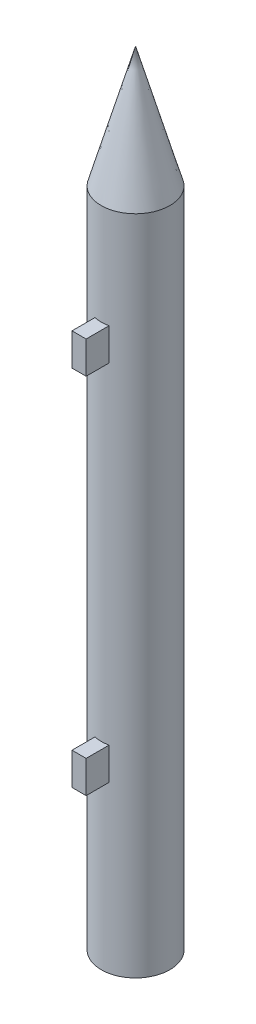
ISO-10303-21;
HEADER;
FILE_DESCRIPTION(('STEP AP214'),'2;1');
FILE_NAME('part.step','',(''),(''),'','','');
FILE_SCHEMA(('AUTOMOTIVE_DESIGN { 1 0 10303 214 1 1 1 1 }'));
ENDSEC;
DATA;
#1=APPLICATION_CONTEXT('core data for automotive mechanical design processes');
#2=APPLICATION_PROTOCOL_DEFINITION('international standard','automotive_design',2000,#1);
#3=PRODUCT_CONTEXT('',#1,'mechanical');
#4=PRODUCT('Part','Part','',(#3));
#5=PRODUCT_RELATED_PRODUCT_CATEGORY('part','',(#4));
#6=PRODUCT_DEFINITION_FORMATION('','',#4);
#7=PRODUCT_DEFINITION_CONTEXT('part definition',#1,'design');
#8=PRODUCT_DEFINITION('design','',#6,#7);
#9=PRODUCT_DEFINITION_SHAPE('','',#8);
#10=(LENGTH_UNIT() NAMED_UNIT(*) SI_UNIT(.MILLI.,.METRE.));
#11=(NAMED_UNIT(*) PLANE_ANGLE_UNIT() SI_UNIT($,.RADIAN.));
#12=(NAMED_UNIT(*) SI_UNIT($,.STERADIAN.) SOLID_ANGLE_UNIT());
#13=UNCERTAINTY_MEASURE_WITH_UNIT(LENGTH_MEASURE(1.E-05),#10,'distance_accuracy_value','');
#14=(GEOMETRIC_REPRESENTATION_CONTEXT(3) GLOBAL_UNCERTAINTY_ASSIGNED_CONTEXT((#13)) GLOBAL_UNIT_ASSIGNED_CONTEXT((#10,
#11,#12)) REPRESENTATION_CONTEXT('',''));
#15=CARTESIAN_POINT('',(0.,0.,0.));
#16=DIRECTION('',(0.,0.,1.));
#17=DIRECTION('',(1.,0.,0.));
#18=AXIS2_PLACEMENT_3D('',#15,#16,#17);
#19=CARTESIAN_POINT('',(0.,6.,-34.));
#20=DIRECTION('',(0.,-1.,0.));
#21=DIRECTION('',(0.,0.,-1.));
#22=AXIS2_PLACEMENT_3D('',#19,#20,#21);
#23=CYLINDRICAL_SURFACE('',#22,8.5);
#24=CARTESIAN_POINT('',(0.,170.,-34.));
#25=DIRECTION('',(0.,-1.,0.));
#26=DIRECTION('',(0.,0.,-1.));
#27=AXIS2_PLACEMENT_3D('',#24,#25,#26);
#28=CIRCLE('',#27,8.5);
#29=CARTESIAN_POINT('',(0.,170.,-42.5));
#30=VERTEX_POINT('',#29);
#31=EDGE_CURVE('E124',#30,#30,#28,.T.);
#32=ORIENTED_EDGE('',*,*,#31,.T.);
#33=EDGE_LOOP('',(#32));
#34=FACE_BOUND('',#33,.T.);
#35=CARTESIAN_POINT('',(0.,6.,-34.));
#36=DIRECTION('',(0.,-1.,0.));
#37=DIRECTION('',(0.,0.,-1.));
#38=AXIS2_PLACEMENT_3D('',#35,#36,#37);
#39=CIRCLE('',#38,8.5);
#40=CARTESIAN_POINT('',(0.,6.,-42.5));
#41=VERTEX_POINT('',#40);
#42=EDGE_CURVE('E129',#41,#41,#39,.T.);
#43=ORIENTED_EDGE('',*,*,#42,.F.);
#44=EDGE_LOOP('',(#43));
#45=FACE_BOUND('',#44,.T.);
#46=CARTESIAN_POINT('',(0.,55.,-34.));
#47=DIRECTION('',(0.,-1.,0.));
#48=DIRECTION('',(0.,0.,-1.));
#49=AXIS2_PLACEMENT_3D('',#46,#47,#48);
#50=CIRCLE('',#49,8.5);
#51=CARTESIAN_POINT('',(-1.75,55.,-25.6820976201929));
#52=VERTEX_POINT('',#51);
#53=CARTESIAN_POINT('',(1.75,55.,-25.6820976201929));
#54=VERTEX_POINT('',#53);
#55=EDGE_CURVE('E161',#52,#54,#50,.F.);
#56=ORIENTED_EDGE('',*,*,#55,.T.);
#57=DIRECTION('',(0.,-1.,0.));
#58=VECTOR('',#57,1.);
#59=CARTESIAN_POINT('',(1.75,6.,-25.6820976201929));
#60=LINE('',#59,#58);
#61=CARTESIAN_POINT('',(1.75,47.,-25.6820976201929));
#62=VERTEX_POINT('',#61);
#63=EDGE_CURVE('E164',#54,#62,#60,.T.);
#64=ORIENTED_EDGE('',*,*,#63,.T.);
#65=CARTESIAN_POINT('',(0.,47.,-34.));
#66=DIRECTION('',(0.,1.,0.));
#67=DIRECTION('',(0.,0.,1.));
#68=AXIS2_PLACEMENT_3D('',#65,#66,#67);
#69=CIRCLE('',#68,8.5);
#70=CARTESIAN_POINT('',(-1.75,47.,-25.6820976201929));
#71=VERTEX_POINT('',#70);
#72=EDGE_CURVE('E162',#62,#71,#69,.F.);
#73=ORIENTED_EDGE('',*,*,#72,.T.);
#74=DIRECTION('',(0.,-1.,0.));
#75=VECTOR('',#74,1.);
#76=CARTESIAN_POINT('',(-1.75,6.,-25.6820976201929));
#77=LINE('',#76,#75);
#78=EDGE_CURVE('E158',#52,#71,#77,.T.);
#79=ORIENTED_EDGE('',*,*,#78,.F.);
#80=EDGE_LOOP('',(#56,#64,#73,#79));
#81=FACE_BOUND('',#80,.T.);
#82=CARTESIAN_POINT('',(0.,145.,-34.));
#83=DIRECTION('',(0.,-1.,0.));
#84=DIRECTION('',(0.,0.,-1.));
#85=AXIS2_PLACEMENT_3D('',#82,#83,#84);
#86=CIRCLE('',#85,8.5);
#87=CARTESIAN_POINT('',(-1.75,145.,-25.6820976201929));
#88=VERTEX_POINT('',#87);
#89=CARTESIAN_POINT('',(1.75,145.,-25.6820976201929));
#90=VERTEX_POINT('',#89);
#91=EDGE_CURVE('E60',#88,#90,#86,.F.);
#92=ORIENTED_EDGE('',*,*,#91,.T.);
#93=DIRECTION('',(0.,-1.,0.));
#94=VECTOR('',#93,1.);
#95=CARTESIAN_POINT('',(1.75,6.,-25.6820976201929));
#96=LINE('',#95,#94);
#97=CARTESIAN_POINT('',(1.75,137.,-25.6820976201929));
#98=VERTEX_POINT('',#97);
#99=EDGE_CURVE('E11',#90,#98,#96,.T.);
#100=ORIENTED_EDGE('',*,*,#99,.T.);
#101=CARTESIAN_POINT('',(0.,137.,-34.));
#102=DIRECTION('',(0.,1.,0.));
#103=DIRECTION('',(0.,0.,1.));
#104=AXIS2_PLACEMENT_3D('',#101,#102,#103);
#105=CIRCLE('',#104,8.5);
#106=CARTESIAN_POINT('',(-1.75,137.,-25.6820976201929));
#107=VERTEX_POINT('',#106);
#108=EDGE_CURVE('E50',#98,#107,#105,.F.);
#109=ORIENTED_EDGE('',*,*,#108,.T.);
#110=DIRECTION('',(0.,-1.,0.));
#111=VECTOR('',#110,1.);
#112=CARTESIAN_POINT('',(-1.75,6.,-25.6820976201929));
#113=LINE('',#112,#111);
#114=EDGE_CURVE('E170',#88,#107,#113,.T.);
#115=ORIENTED_EDGE('',*,*,#114,.F.);
#116=EDGE_LOOP('',(#92,#100,#109,#115));
#117=FACE_BOUND('',#116,.T.);
#118=ADVANCED_FACE('F39',(#34,#45,#81,#117),#23,.T.);
#119=CARTESIAN_POINT('',(0.,6.,-42.5));
#120=DIRECTION('',(0.,-1.,0.));
#121=DIRECTION('',(0.,0.,-1.));
#122=AXIS2_PLACEMENT_3D('',#119,#120,#121);
#123=PLANE('',#122);
#124=ORIENTED_EDGE('',*,*,#42,.T.);
#125=EDGE_LOOP('',(#124));
#126=FACE_BOUND('',#125,.T.);
#127=ADVANCED_FACE('F41',(#126),#123,.T.);
#128=CARTESIAN_POINT('',(0.,170.,-34.));
#129=DIRECTION('',(0.,-1.,0.));
#130=DIRECTION('',(0.,0.,-1.));
#131=AXIS2_PLACEMENT_3D('',#128,#129,#130);
#132=CONICAL_SURFACE('',#131,8.5,0.276097019395437);
#133=CARTESIAN_POINT('',(0.,200.,-34.));
#134=VERTEX_POINT('',#133);
#135=VERTEX_LOOP('',#134);
#136=FACE_BOUND('',#135,.T.);
#137=ORIENTED_EDGE('',*,*,#31,.F.);
#138=EDGE_LOOP('',(#137));
#139=FACE_BOUND('',#138,.T.);
#140=ADVANCED_FACE('F194',(#136,#139),#132,.T.);
#141=CARTESIAN_POINT('',(1.75,47.,-20.));
#142=DIRECTION('',(0.,0.,-1.));
#143=DIRECTION('',(-1.,0.,0.));
#144=AXIS2_PLACEMENT_3D('',#141,#142,#143);
#145=PLANE('',#144);
#146=DIRECTION('',(0.,-1.,0.));
#147=VECTOR('',#146,1.);
#148=CARTESIAN_POINT('',(-1.75,47.,-20.));
#149=LINE('',#148,#147);
#150=CARTESIAN_POINT('',(-1.75,55.,-20.));
#151=VERTEX_POINT('',#150);
#152=CARTESIAN_POINT('',(-1.75,47.,-20.));
#153=VERTEX_POINT('',#152);
#154=EDGE_CURVE('E150',#151,#153,#149,.T.);
#155=ORIENTED_EDGE('',*,*,#154,.T.);
#156=DIRECTION('',(-1.,0.,0.));
#157=VECTOR('',#156,1.);
#158=CARTESIAN_POINT('',(1.75,47.,-20.));
#159=LINE('',#158,#157);
#160=CARTESIAN_POINT('',(1.75,47.,-20.));
#161=VERTEX_POINT('',#160);
#162=EDGE_CURVE('E133',#161,#153,#159,.T.);
#163=ORIENTED_EDGE('',*,*,#162,.F.);
#164=DIRECTION('',(0.,-1.,0.));
#165=VECTOR('',#164,1.);
#166=CARTESIAN_POINT('',(1.75,47.,-20.));
#167=LINE('',#166,#165);
#168=CARTESIAN_POINT('',(1.75,55.,-20.));
#169=VERTEX_POINT('',#168);
#170=EDGE_CURVE('E145',#169,#161,#167,.T.);
#171=ORIENTED_EDGE('',*,*,#170,.F.);
#172=DIRECTION('',(-1.,0.,0.));
#173=VECTOR('',#172,1.);
#174=CARTESIAN_POINT('',(1.75,55.,-20.));
#175=LINE('',#174,#173);
#176=EDGE_CURVE('E140',#169,#151,#175,.T.);
#177=ORIENTED_EDGE('',*,*,#176,.T.);
#178=EDGE_LOOP('',(#155,#163,#171,#177));
#179=FACE_BOUND('',#178,.T.);
#180=ADVANCED_FACE('F199',(#179),#145,.F.);
#181=CARTESIAN_POINT('',(1.75,47.,-34.));
#182=DIRECTION('',(0.,1.,0.));
#183=DIRECTION('',(0.,0.,1.));
#184=AXIS2_PLACEMENT_3D('',#181,#182,#183);
#185=PLANE('',#184);
#186=ORIENTED_EDGE('',*,*,#72,.F.);
#187=DIRECTION('',(0.,0.,-1.));
#188=VECTOR('',#187,1.);
#189=CARTESIAN_POINT('',(1.75,47.,-34.));
#190=LINE('',#189,#188);
#191=EDGE_CURVE('E151',#161,#62,#190,.T.);
#192=ORIENTED_EDGE('',*,*,#191,.F.);
#193=ORIENTED_EDGE('',*,*,#162,.T.);
#194=DIRECTION('',(0.,0.,-1.));
#195=VECTOR('',#194,1.);
#196=CARTESIAN_POINT('',(-1.75,47.,-34.));
#197=LINE('',#196,#195);
#198=EDGE_CURVE('E141',#153,#71,#197,.T.);
#199=ORIENTED_EDGE('',*,*,#198,.T.);
#200=EDGE_LOOP('',(#186,#192,#193,#199));
#201=FACE_BOUND('',#200,.T.);
#202=ADVANCED_FACE('F213',(#201),#185,.F.);
#203=CARTESIAN_POINT('',(1.75,55.,-20.));
#204=DIRECTION('',(0.,-1.,0.));
#205=DIRECTION('',(0.,0.,-1.));
#206=AXIS2_PLACEMENT_3D('',#203,#204,#205);
#207=PLANE('',#206);
#208=ORIENTED_EDGE('',*,*,#55,.F.);
#209=DIRECTION('',(0.,0.,1.));
#210=VECTOR('',#209,1.);
#211=CARTESIAN_POINT('',(-1.75,55.,-20.));
#212=LINE('',#211,#210);
#213=EDGE_CURVE('E143',#52,#151,#212,.T.);
#214=ORIENTED_EDGE('',*,*,#213,.T.);
#215=ORIENTED_EDGE('',*,*,#176,.F.);
#216=DIRECTION('',(0.,0.,1.));
#217=VECTOR('',#216,1.);
#218=CARTESIAN_POINT('',(1.75,55.,-20.));
#219=LINE('',#218,#217);
#220=EDGE_CURVE('E139',#54,#169,#219,.T.);
#221=ORIENTED_EDGE('',*,*,#220,.F.);
#222=EDGE_LOOP('',(#208,#214,#215,#221));
#223=FACE_BOUND('',#222,.T.);
#224=ADVANCED_FACE('F206',(#223),#207,.F.);
#225=CARTESIAN_POINT('',(1.75,0.,0.));
#226=DIRECTION('',(-1.,0.,0.));
#227=DIRECTION('',(0.,0.,1.));
#228=AXIS2_PLACEMENT_3D('',#225,#226,#227);
#229=PLANE('',#228);
#230=ORIENTED_EDGE('',*,*,#63,.F.);
#231=ORIENTED_EDGE('',*,*,#220,.T.);
#232=ORIENTED_EDGE('',*,*,#170,.T.);
#233=ORIENTED_EDGE('',*,*,#191,.T.);
#234=EDGE_LOOP('',(#230,#231,#232,#233));
#235=FACE_BOUND('',#234,.T.);
#236=ADVANCED_FACE('F205',(#235),#229,.F.);
#237=CARTESIAN_POINT('',(-1.75,0.,0.));
#238=DIRECTION('',(-1.,0.,0.));
#239=DIRECTION('',(0.,0.,1.));
#240=AXIS2_PLACEMENT_3D('',#237,#238,#239);
#241=PLANE('',#240);
#242=ORIENTED_EDGE('',*,*,#213,.F.);
#243=ORIENTED_EDGE('',*,*,#78,.T.);
#244=ORIENTED_EDGE('',*,*,#198,.F.);
#245=ORIENTED_EDGE('',*,*,#154,.F.);
#246=EDGE_LOOP('',(#242,#243,#244,#245));
#247=FACE_BOUND('',#246,.T.);
#248=ADVANCED_FACE('F202',(#247),#241,.T.);
#249=CARTESIAN_POINT('',(1.75,137.,-20.));
#250=DIRECTION('',(0.,0.,-1.));
#251=DIRECTION('',(-1.,0.,0.));
#252=AXIS2_PLACEMENT_3D('',#249,#250,#251);
#253=PLANE('',#252);
#254=DIRECTION('',(0.,-1.,0.));
#255=VECTOR('',#254,1.);
#256=CARTESIAN_POINT('',(-1.75,137.,-20.));
#257=LINE('',#256,#255);
#258=CARTESIAN_POINT('',(-1.75,145.,-20.));
#259=VERTEX_POINT('',#258);
#260=CARTESIAN_POINT('',(-1.75,137.,-20.));
#261=VERTEX_POINT('',#260);
#262=EDGE_CURVE('E122',#259,#261,#257,.T.);
#263=ORIENTED_EDGE('',*,*,#262,.T.);
#264=DIRECTION('',(-1.,0.,0.));
#265=VECTOR('',#264,1.);
#266=CARTESIAN_POINT('',(1.75,137.,-20.));
#267=LINE('',#266,#265);
#268=CARTESIAN_POINT('',(1.75,137.,-20.));
#269=VERTEX_POINT('',#268);
#270=EDGE_CURVE('E107',#269,#261,#267,.T.);
#271=ORIENTED_EDGE('',*,*,#270,.F.);
#272=DIRECTION('',(0.,-1.,0.));
#273=VECTOR('',#272,1.);
#274=CARTESIAN_POINT('',(1.75,137.,-20.));
#275=LINE('',#274,#273);
#276=CARTESIAN_POINT('',(1.75,145.,-20.));
#277=VERTEX_POINT('',#276);
#278=EDGE_CURVE('E115',#277,#269,#275,.T.);
#279=ORIENTED_EDGE('',*,*,#278,.F.);
#280=DIRECTION('',(-1.,0.,0.));
#281=VECTOR('',#280,1.);
#282=CARTESIAN_POINT('',(1.75,145.,-20.));
#283=LINE('',#282,#281);
#284=EDGE_CURVE('E127',#277,#259,#283,.T.);
#285=ORIENTED_EDGE('',*,*,#284,.T.);
#286=EDGE_LOOP('',(#263,#271,#279,#285));
#287=FACE_BOUND('',#286,.T.);
#288=ADVANCED_FACE('F125',(#287),#253,.F.);
#289=CARTESIAN_POINT('',(1.75,137.,-34.));
#290=DIRECTION('',(0.,1.,0.));
#291=DIRECTION('',(0.,0.,1.));
#292=AXIS2_PLACEMENT_3D('',#289,#290,#291);
#293=PLANE('',#292);
#294=ORIENTED_EDGE('',*,*,#108,.F.);
#295=DIRECTION('',(0.,0.,-1.));
#296=VECTOR('',#295,1.);
#297=CARTESIAN_POINT('',(1.75,137.,-34.));
#298=LINE('',#297,#296);
#299=EDGE_CURVE('E103',#269,#98,#298,.T.);
#300=ORIENTED_EDGE('',*,*,#299,.F.);
#301=ORIENTED_EDGE('',*,*,#270,.T.);
#302=DIRECTION('',(0.,0.,-1.));
#303=VECTOR('',#302,1.);
#304=CARTESIAN_POINT('',(-1.75,137.,-34.));
#305=LINE('',#304,#303);
#306=EDGE_CURVE('E175',#261,#107,#305,.T.);
#307=ORIENTED_EDGE('',*,*,#306,.T.);
#308=EDGE_LOOP('',(#294,#300,#301,#307));
#309=FACE_BOUND('',#308,.T.);
#310=ADVANCED_FACE('F104',(#309),#293,.F.);
#311=CARTESIAN_POINT('',(1.75,145.,-20.));
#312=DIRECTION('',(0.,-1.,0.));
#313=DIRECTION('',(0.,0.,-1.));
#314=AXIS2_PLACEMENT_3D('',#311,#312,#313);
#315=PLANE('',#314);
#316=ORIENTED_EDGE('',*,*,#91,.F.);
#317=DIRECTION('',(0.,0.,1.));
#318=VECTOR('',#317,1.);
#319=CARTESIAN_POINT('',(-1.75,145.,-20.));
#320=LINE('',#319,#318);
#321=EDGE_CURVE('E117',#88,#259,#320,.T.);
#322=ORIENTED_EDGE('',*,*,#321,.T.);
#323=ORIENTED_EDGE('',*,*,#284,.F.);
#324=DIRECTION('',(0.,0.,1.));
#325=VECTOR('',#324,1.);
#326=CARTESIAN_POINT('',(1.75,145.,-20.));
#327=LINE('',#326,#325);
#328=EDGE_CURVE('E112',#90,#277,#327,.T.);
#329=ORIENTED_EDGE('',*,*,#328,.F.);
#330=EDGE_LOOP('',(#316,#322,#323,#329));
#331=FACE_BOUND('',#330,.T.);
#332=ADVANCED_FACE('F178',(#331),#315,.F.);
#333=CARTESIAN_POINT('',(1.75,0.,0.));
#334=DIRECTION('',(-1.,0.,0.));
#335=DIRECTION('',(0.,0.,1.));
#336=AXIS2_PLACEMENT_3D('',#333,#334,#335);
#337=PLANE('',#336);
#338=ORIENTED_EDGE('',*,*,#99,.F.);
#339=ORIENTED_EDGE('',*,*,#328,.T.);
#340=ORIENTED_EDGE('',*,*,#278,.T.);
#341=ORIENTED_EDGE('',*,*,#299,.T.);
#342=EDGE_LOOP('',(#338,#339,#340,#341));
#343=FACE_BOUND('',#342,.T.);
#344=ADVANCED_FACE('F113',(#343),#337,.F.);
#345=CARTESIAN_POINT('',(-1.75,0.,0.));
#346=DIRECTION('',(-1.,0.,0.));
#347=DIRECTION('',(0.,0.,1.));
#348=AXIS2_PLACEMENT_3D('',#345,#346,#347);
#349=PLANE('',#348);
#350=ORIENTED_EDGE('',*,*,#321,.F.);
#351=ORIENTED_EDGE('',*,*,#114,.T.);
#352=ORIENTED_EDGE('',*,*,#306,.F.);
#353=ORIENTED_EDGE('',*,*,#262,.F.);
#354=EDGE_LOOP('',(#350,#351,#352,#353));
#355=FACE_BOUND('',#354,.T.);
#356=ADVANCED_FACE('F171',(#355),#349,.T.);
#357=CLOSED_SHELL('',(#118,#127,#140,#180,#202,#224,#236,#248,#288,#310,#332,#344,#356));
#358=MANIFOLD_SOLID_BREP('B2',#357);
#359=ADVANCED_BREP_SHAPE_REPRESENTATION('',(#18,#358),#14);
#360=SHAPE_DEFINITION_REPRESENTATION(#9,#359);
ENDSEC;
END-ISO-10303-21;
